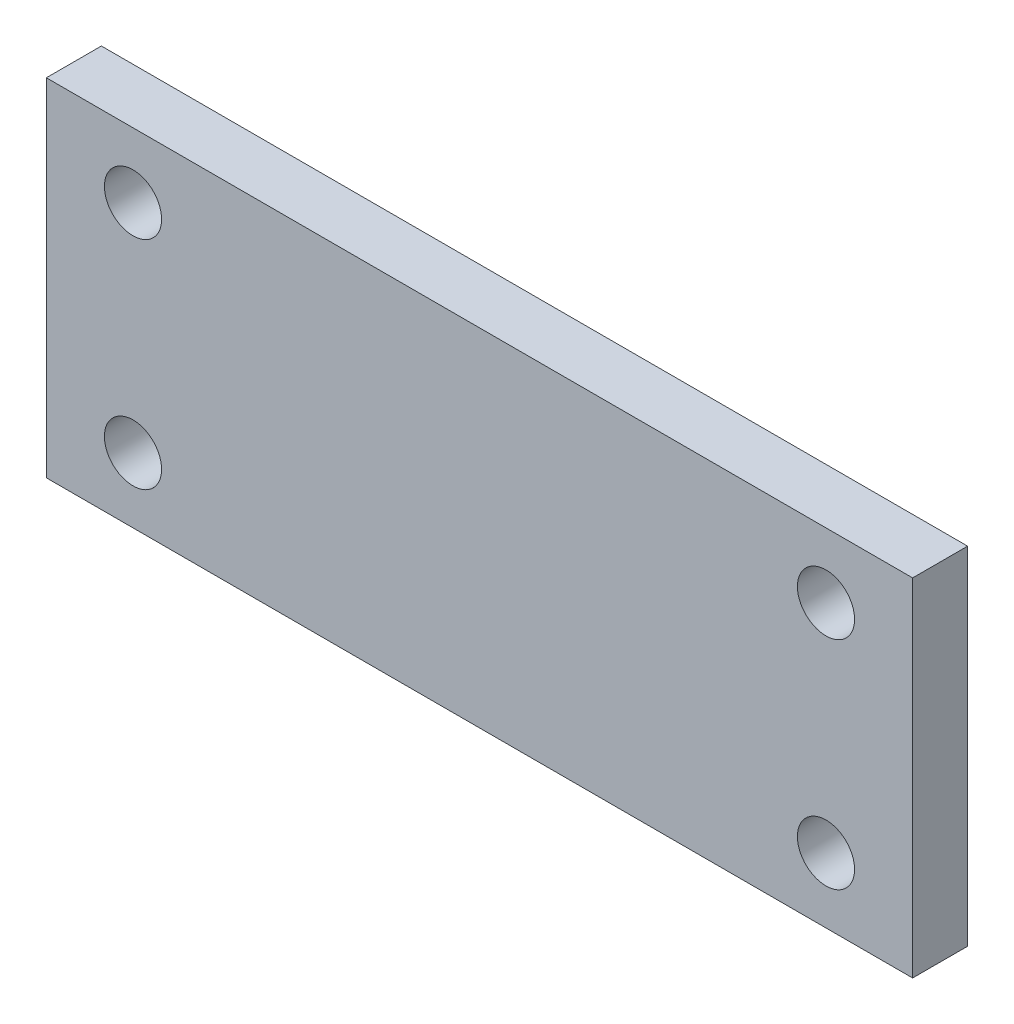
ISO-10303-21;
HEADER;
FILE_DESCRIPTION(('STEP AP214'),'2;1');
FILE_NAME('part.step','',(''),(''),'','','');
FILE_SCHEMA(('AUTOMOTIVE_DESIGN { 1 0 10303 214 1 1 1 1 }'));
ENDSEC;
DATA;
#1=APPLICATION_CONTEXT('core data for automotive mechanical design processes');
#2=APPLICATION_PROTOCOL_DEFINITION('international standard','automotive_design',2000,#1);
#3=PRODUCT_CONTEXT('',#1,'mechanical');
#4=PRODUCT('Part','Part','',(#3));
#5=PRODUCT_RELATED_PRODUCT_CATEGORY('part','',(#4));
#6=PRODUCT_DEFINITION_FORMATION('','',#4);
#7=PRODUCT_DEFINITION_CONTEXT('part definition',#1,'design');
#8=PRODUCT_DEFINITION('design','',#6,#7);
#9=PRODUCT_DEFINITION_SHAPE('','',#8);
#10=(LENGTH_UNIT() NAMED_UNIT(*) SI_UNIT(.MILLI.,.METRE.));
#11=(NAMED_UNIT(*) PLANE_ANGLE_UNIT() SI_UNIT($,.RADIAN.));
#12=(NAMED_UNIT(*) SI_UNIT($,.STERADIAN.) SOLID_ANGLE_UNIT());
#13=UNCERTAINTY_MEASURE_WITH_UNIT(LENGTH_MEASURE(1.E-05),#10,'distance_accuracy_value','');
#14=(GEOMETRIC_REPRESENTATION_CONTEXT(3) GLOBAL_UNCERTAINTY_ASSIGNED_CONTEXT((#13)) GLOBAL_UNIT_ASSIGNED_CONTEXT((#10,
#11,#12)) REPRESENTATION_CONTEXT('',''));
#15=CARTESIAN_POINT('',(0.,0.,0.));
#16=DIRECTION('',(0.,0.,1.));
#17=DIRECTION('',(1.,0.,0.));
#18=AXIS2_PLACEMENT_3D('',#15,#16,#17);
#19=CARTESIAN_POINT('',(0.,0.,3.175));
#20=DIRECTION('',(0.,0.,1.));
#21=DIRECTION('',(1.,0.,0.));
#22=AXIS2_PLACEMENT_3D('',#19,#20,#21);
#23=PLANE('',#22);
#24=CARTESIAN_POINT('',(40.,-12.5,3.175));
#25=DIRECTION('',(0.,0.,1.));
#26=DIRECTION('',(-1.,0.,0.));
#27=AXIS2_PLACEMENT_3D('',#24,#25,#26);
#28=CIRCLE('',#27,3.29999999999999);
#29=CARTESIAN_POINT('',(36.7,-12.5,3.175));
#30=VERTEX_POINT('',#29);
#31=EDGE_CURVE('E120',#30,#30,#28,.T.);
#32=ORIENTED_EDGE('',*,*,#31,.F.);
#33=EDGE_LOOP('',(#32));
#34=FACE_BOUND('',#33,.T.);
#35=CARTESIAN_POINT('',(-40.,12.5,3.175));
#36=DIRECTION('',(0.,0.,1.));
#37=DIRECTION('',(1.,0.,0.));
#38=AXIS2_PLACEMENT_3D('',#35,#36,#37);
#39=CIRCLE('',#38,3.29999999999999);
#40=CARTESIAN_POINT('',(-36.7,12.5,3.175));
#41=VERTEX_POINT('',#40);
#42=EDGE_CURVE('E99',#41,#41,#39,.T.);
#43=ORIENTED_EDGE('',*,*,#42,.F.);
#44=EDGE_LOOP('',(#43));
#45=FACE_BOUND('',#44,.T.);
#46=DIRECTION('',(0.,-1.,0.));
#47=VECTOR('',#46,1.);
#48=CARTESIAN_POINT('',(-50.,-20.,3.175));
#49=LINE('',#48,#47);
#50=CARTESIAN_POINT('',(-50.,20.,3.175));
#51=VERTEX_POINT('',#50);
#52=CARTESIAN_POINT('',(-50.,-20.,3.175));
#53=VERTEX_POINT('',#52);
#54=EDGE_CURVE('E84',#51,#53,#49,.T.);
#55=ORIENTED_EDGE('',*,*,#54,.T.);
#56=DIRECTION('',(1.,0.,0.));
#57=VECTOR('',#56,1.);
#58=CARTESIAN_POINT('',(50.,-20.,3.175));
#59=LINE('',#58,#57);
#60=CARTESIAN_POINT('',(50.,-20.,3.175));
#61=VERTEX_POINT('',#60);
#62=EDGE_CURVE('E79',#53,#61,#59,.T.);
#63=ORIENTED_EDGE('',*,*,#62,.T.);
#64=DIRECTION('',(0.,1.,0.));
#65=VECTOR('',#64,1.);
#66=CARTESIAN_POINT('',(50.,-20.,3.175));
#67=LINE('',#66,#65);
#68=CARTESIAN_POINT('',(50.,20.,3.175));
#69=VERTEX_POINT('',#68);
#70=EDGE_CURVE('E82',#61,#69,#67,.T.);
#71=ORIENTED_EDGE('',*,*,#70,.T.);
#72=DIRECTION('',(-1.,0.,0.));
#73=VECTOR('',#72,1.);
#74=CARTESIAN_POINT('',(50.,20.,3.175));
#75=LINE('',#74,#73);
#76=EDGE_CURVE('E49',#69,#51,#75,.T.);
#77=ORIENTED_EDGE('',*,*,#76,.T.);
#78=EDGE_LOOP('',(#55,#63,#71,#77));
#79=FACE_BOUND('',#78,.T.);
#80=CARTESIAN_POINT('',(-40.,-12.5,3.175));
#81=DIRECTION('',(0.,0.,1.));
#82=DIRECTION('',(1.,0.,0.));
#83=AXIS2_PLACEMENT_3D('',#80,#81,#82);
#84=CIRCLE('',#83,3.29999999999999);
#85=CARTESIAN_POINT('',(-36.7,-12.5,3.175));
#86=VERTEX_POINT('',#85);
#87=EDGE_CURVE('E114',#86,#86,#84,.T.);
#88=ORIENTED_EDGE('',*,*,#87,.F.);
#89=EDGE_LOOP('',(#88));
#90=FACE_BOUND('',#89,.T.);
#91=CARTESIAN_POINT('',(40.,12.5,3.175));
#92=DIRECTION('',(0.,0.,1.));
#93=DIRECTION('',(-1.,0.,0.));
#94=AXIS2_PLACEMENT_3D('',#91,#92,#93);
#95=CIRCLE('',#94,3.29999999999999);
#96=CARTESIAN_POINT('',(36.7,12.5,3.175));
#97=VERTEX_POINT('',#96);
#98=EDGE_CURVE('E126',#97,#97,#95,.T.);
#99=ORIENTED_EDGE('',*,*,#98,.F.);
#100=EDGE_LOOP('',(#99));
#101=FACE_BOUND('',#100,.T.);
#102=ADVANCED_FACE('F32',(#34,#45,#79,#90,#101),#23,.T.);
#103=CARTESIAN_POINT('',(0.,0.,-3.175));
#104=DIRECTION('',(0.,0.,1.));
#105=DIRECTION('',(1.,0.,0.));
#106=AXIS2_PLACEMENT_3D('',#103,#104,#105);
#107=PLANE('',#106);
#108=CARTESIAN_POINT('',(40.,-12.5,-3.175));
#109=DIRECTION('',(0.,0.,1.));
#110=DIRECTION('',(-1.,0.,0.));
#111=AXIS2_PLACEMENT_3D('',#108,#109,#110);
#112=CIRCLE('',#111,3.29999999999999);
#113=CARTESIAN_POINT('',(36.7,-12.5,-3.175));
#114=VERTEX_POINT('',#113);
#115=EDGE_CURVE('E123',#114,#114,#112,.T.);
#116=ORIENTED_EDGE('',*,*,#115,.T.);
#117=EDGE_LOOP('',(#116));
#118=FACE_BOUND('',#117,.T.);
#119=CARTESIAN_POINT('',(-40.,12.5,-3.175));
#120=DIRECTION('',(0.,0.,1.));
#121=DIRECTION('',(1.,0.,0.));
#122=AXIS2_PLACEMENT_3D('',#119,#120,#121);
#123=CIRCLE('',#122,3.29999999999999);
#124=CARTESIAN_POINT('',(-36.7,12.5,-3.175));
#125=VERTEX_POINT('',#124);
#126=EDGE_CURVE('E111',#125,#125,#123,.T.);
#127=ORIENTED_EDGE('',*,*,#126,.T.);
#128=EDGE_LOOP('',(#127));
#129=FACE_BOUND('',#128,.T.);
#130=DIRECTION('',(0.,-1.,0.));
#131=VECTOR('',#130,1.);
#132=CARTESIAN_POINT('',(-50.,-20.,-3.175));
#133=LINE('',#132,#131);
#134=CARTESIAN_POINT('',(-50.,20.,-3.175));
#135=VERTEX_POINT('',#134);
#136=CARTESIAN_POINT('',(-50.,-20.,-3.175));
#137=VERTEX_POINT('',#136);
#138=EDGE_CURVE('E96',#135,#137,#133,.T.);
#139=ORIENTED_EDGE('',*,*,#138,.F.);
#140=DIRECTION('',(-1.,0.,0.));
#141=VECTOR('',#140,1.);
#142=CARTESIAN_POINT('',(50.,20.,-3.175));
#143=LINE('',#142,#141);
#144=CARTESIAN_POINT('',(50.,20.,-3.175));
#145=VERTEX_POINT('',#144);
#146=EDGE_CURVE('E72',#145,#135,#143,.T.);
#147=ORIENTED_EDGE('',*,*,#146,.F.);
#148=DIRECTION('',(0.,1.,0.));
#149=VECTOR('',#148,1.);
#150=CARTESIAN_POINT('',(50.,-20.,-3.175));
#151=LINE('',#150,#149);
#152=CARTESIAN_POINT('',(50.,-20.,-3.175));
#153=VERTEX_POINT('',#152);
#154=EDGE_CURVE('E66',#153,#145,#151,.T.);
#155=ORIENTED_EDGE('',*,*,#154,.F.);
#156=DIRECTION('',(1.,0.,0.));
#157=VECTOR('',#156,1.);
#158=CARTESIAN_POINT('',(50.,-20.,-3.175));
#159=LINE('',#158,#157);
#160=EDGE_CURVE('E88',#137,#153,#159,.T.);
#161=ORIENTED_EDGE('',*,*,#160,.F.);
#162=EDGE_LOOP('',(#139,#147,#155,#161));
#163=FACE_BOUND('',#162,.T.);
#164=CARTESIAN_POINT('',(-40.,-12.5,-3.175));
#165=DIRECTION('',(0.,0.,1.));
#166=DIRECTION('',(1.,0.,0.));
#167=AXIS2_PLACEMENT_3D('',#164,#165,#166);
#168=CIRCLE('',#167,3.29999999999999);
#169=CARTESIAN_POINT('',(-36.7,-12.5,-3.175));
#170=VERTEX_POINT('',#169);
#171=EDGE_CURVE('E117',#170,#170,#168,.T.);
#172=ORIENTED_EDGE('',*,*,#171,.T.);
#173=EDGE_LOOP('',(#172));
#174=FACE_BOUND('',#173,.T.);
#175=CARTESIAN_POINT('',(40.,12.5,-3.175));
#176=DIRECTION('',(0.,0.,1.));
#177=DIRECTION('',(-1.,0.,0.));
#178=AXIS2_PLACEMENT_3D('',#175,#176,#177);
#179=CIRCLE('',#178,3.29999999999999);
#180=CARTESIAN_POINT('',(36.7,12.5,-3.175));
#181=VERTEX_POINT('',#180);
#182=EDGE_CURVE('E129',#181,#181,#179,.T.);
#183=ORIENTED_EDGE('',*,*,#182,.T.);
#184=EDGE_LOOP('',(#183));
#185=FACE_BOUND('',#184,.T.);
#186=ADVANCED_FACE('F107',(#118,#129,#163,#174,#185),#107,.F.);
#187=CARTESIAN_POINT('',(-50.,-20.,3.175));
#188=DIRECTION('',(1.,0.,0.));
#189=DIRECTION('',(0.,0.,-1.));
#190=AXIS2_PLACEMENT_3D('',#187,#188,#189);
#191=PLANE('',#190);
#192=ORIENTED_EDGE('',*,*,#138,.T.);
#193=DIRECTION('',(0.,0.,-1.));
#194=VECTOR('',#193,1.);
#195=CARTESIAN_POINT('',(-50.,-20.,3.175));
#196=LINE('',#195,#194);
#197=EDGE_CURVE('E11',#53,#137,#196,.T.);
#198=ORIENTED_EDGE('',*,*,#197,.F.);
#199=ORIENTED_EDGE('',*,*,#54,.F.);
#200=DIRECTION('',(0.,0.,-1.));
#201=VECTOR('',#200,1.);
#202=CARTESIAN_POINT('',(-50.,20.,3.175));
#203=LINE('',#202,#201);
#204=EDGE_CURVE('E92',#51,#135,#203,.T.);
#205=ORIENTED_EDGE('',*,*,#204,.T.);
#206=EDGE_LOOP('',(#192,#198,#199,#205));
#207=FACE_BOUND('',#206,.T.);
#208=ADVANCED_FACE('F34',(#207),#191,.F.);
#209=CARTESIAN_POINT('',(50.,-20.,3.175));
#210=DIRECTION('',(0.,1.,0.));
#211=DIRECTION('',(0.,0.,1.));
#212=AXIS2_PLACEMENT_3D('',#209,#210,#211);
#213=PLANE('',#212);
#214=ORIENTED_EDGE('',*,*,#160,.T.);
#215=DIRECTION('',(0.,0.,-1.));
#216=VECTOR('',#215,1.);
#217=CARTESIAN_POINT('',(50.,-20.,3.175));
#218=LINE('',#217,#216);
#219=EDGE_CURVE('E41',#61,#153,#218,.T.);
#220=ORIENTED_EDGE('',*,*,#219,.F.);
#221=ORIENTED_EDGE('',*,*,#62,.F.);
#222=ORIENTED_EDGE('',*,*,#197,.T.);
#223=EDGE_LOOP('',(#214,#220,#221,#222));
#224=FACE_BOUND('',#223,.T.);
#225=ADVANCED_FACE('F87',(#224),#213,.F.);
#226=CARTESIAN_POINT('',(50.,-20.,3.175));
#227=DIRECTION('',(-1.,0.,0.));
#228=DIRECTION('',(0.,0.,1.));
#229=AXIS2_PLACEMENT_3D('',#226,#227,#228);
#230=PLANE('',#229);
#231=ORIENTED_EDGE('',*,*,#154,.T.);
#232=DIRECTION('',(0.,0.,-1.));
#233=VECTOR('',#232,1.);
#234=CARTESIAN_POINT('',(50.,20.,3.175));
#235=LINE('',#234,#233);
#236=EDGE_CURVE('E89',#69,#145,#235,.T.);
#237=ORIENTED_EDGE('',*,*,#236,.F.);
#238=ORIENTED_EDGE('',*,*,#70,.F.);
#239=ORIENTED_EDGE('',*,*,#219,.T.);
#240=EDGE_LOOP('',(#231,#237,#238,#239));
#241=FACE_BOUND('',#240,.T.);
#242=ADVANCED_FACE('F90',(#241),#230,.F.);
#243=CARTESIAN_POINT('',(50.,20.,3.175));
#244=DIRECTION('',(0.,-1.,0.));
#245=DIRECTION('',(0.,0.,-1.));
#246=AXIS2_PLACEMENT_3D('',#243,#244,#245);
#247=PLANE('',#246);
#248=ORIENTED_EDGE('',*,*,#146,.T.);
#249=ORIENTED_EDGE('',*,*,#204,.F.);
#250=ORIENTED_EDGE('',*,*,#76,.F.);
#251=ORIENTED_EDGE('',*,*,#236,.T.);
#252=EDGE_LOOP('',(#248,#249,#250,#251));
#253=FACE_BOUND('',#252,.T.);
#254=ADVANCED_FACE('F104',(#253),#247,.F.);
#255=CARTESIAN_POINT('',(-40.,12.5,3.175));
#256=DIRECTION('',(0.,0.,-1.));
#257=DIRECTION('',(-1.,0.,0.));
#258=AXIS2_PLACEMENT_3D('',#255,#256,#257);
#259=CYLINDRICAL_SURFACE('',#258,3.29999999999999);
#260=ORIENTED_EDGE('',*,*,#42,.T.);
#261=EDGE_LOOP('',(#260));
#262=FACE_BOUND('',#261,.T.);
#263=ORIENTED_EDGE('',*,*,#126,.F.);
#264=EDGE_LOOP('',(#263));
#265=FACE_BOUND('',#264,.T.);
#266=ADVANCED_FACE('F149',(#262,#265),#259,.F.);
#267=CARTESIAN_POINT('',(-40.,-12.5,3.175));
#268=DIRECTION('',(0.,0.,-1.));
#269=DIRECTION('',(-1.,0.,0.));
#270=AXIS2_PLACEMENT_3D('',#267,#268,#269);
#271=CYLINDRICAL_SURFACE('',#270,3.29999999999999);
#272=ORIENTED_EDGE('',*,*,#87,.T.);
#273=EDGE_LOOP('',(#272));
#274=FACE_BOUND('',#273,.T.);
#275=ORIENTED_EDGE('',*,*,#171,.F.);
#276=EDGE_LOOP('',(#275));
#277=FACE_BOUND('',#276,.T.);
#278=ADVANCED_FACE('F197',(#274,#277),#271,.F.);
#279=CARTESIAN_POINT('',(40.,-12.5,3.175));
#280=DIRECTION('',(0.,0.,-1.));
#281=DIRECTION('',(-1.,0.,0.));
#282=AXIS2_PLACEMENT_3D('',#279,#280,#281);
#283=CYLINDRICAL_SURFACE('',#282,3.29999999999999);
#284=ORIENTED_EDGE('',*,*,#31,.T.);
#285=EDGE_LOOP('',(#284));
#286=FACE_BOUND('',#285,.T.);
#287=ORIENTED_EDGE('',*,*,#115,.F.);
#288=EDGE_LOOP('',(#287));
#289=FACE_BOUND('',#288,.T.);
#290=ADVANCED_FACE('F205',(#286,#289),#283,.F.);
#291=CARTESIAN_POINT('',(40.,12.5,3.175));
#292=DIRECTION('',(0.,0.,-1.));
#293=DIRECTION('',(-1.,0.,0.));
#294=AXIS2_PLACEMENT_3D('',#291,#292,#293);
#295=CYLINDRICAL_SURFACE('',#294,3.29999999999999);
#296=ORIENTED_EDGE('',*,*,#98,.T.);
#297=EDGE_LOOP('',(#296));
#298=FACE_BOUND('',#297,.T.);
#299=ORIENTED_EDGE('',*,*,#182,.F.);
#300=EDGE_LOOP('',(#299));
#301=FACE_BOUND('',#300,.T.);
#302=ADVANCED_FACE('F135',(#298,#301),#295,.F.);
#303=CLOSED_SHELL('',(#102,#186,#208,#225,#242,#254,#266,#278,#290,#302));
#304=MANIFOLD_SOLID_BREP('B2',#303);
#305=ADVANCED_BREP_SHAPE_REPRESENTATION('',(#18,#304),#14);
#306=SHAPE_DEFINITION_REPRESENTATION(#9,#305);
ENDSEC;
END-ISO-10303-21;
